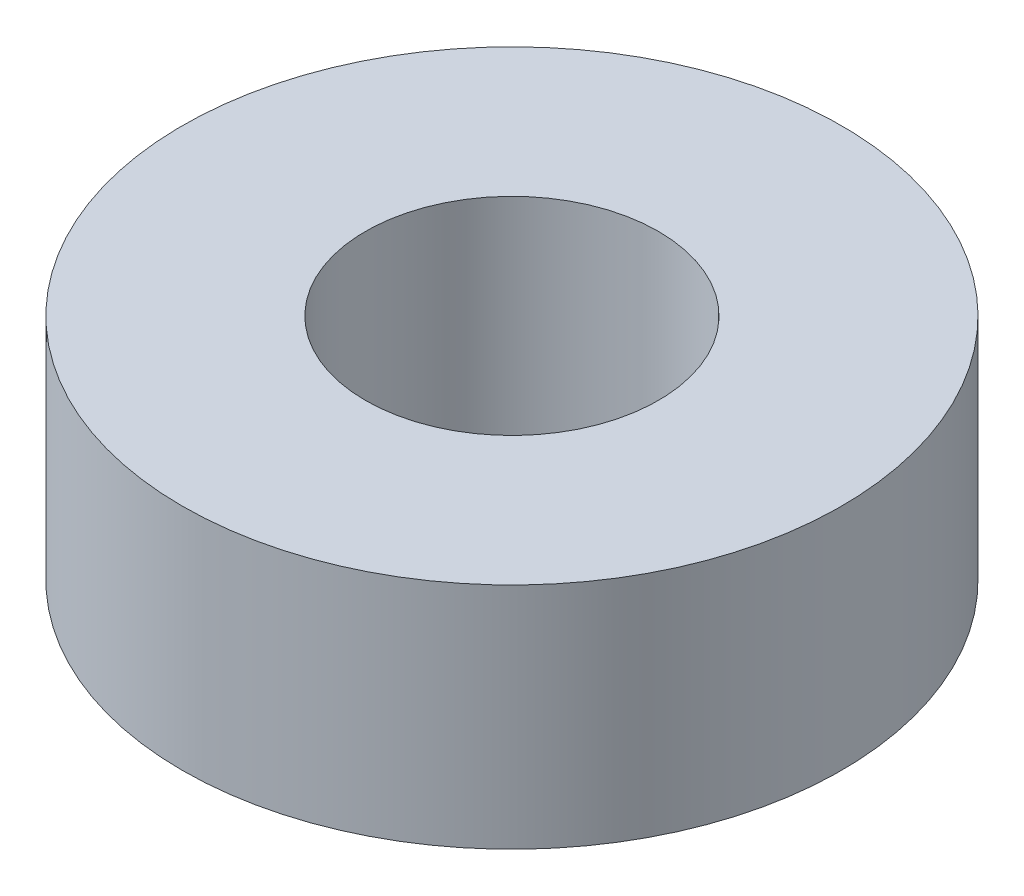
ISO-10303-21;
HEADER;
FILE_DESCRIPTION(('STEP AP214'),'2;1');
FILE_NAME('part.step','',(''),(''),'','','');
FILE_SCHEMA(('AUTOMOTIVE_DESIGN { 1 0 10303 214 1 1 1 1 }'));
ENDSEC;
DATA;
#1=APPLICATION_CONTEXT('core data for automotive mechanical design processes');
#2=APPLICATION_PROTOCOL_DEFINITION('international standard','automotive_design',2000,#1);
#3=PRODUCT_CONTEXT('',#1,'mechanical');
#4=PRODUCT('Part','Part','',(#3));
#5=PRODUCT_RELATED_PRODUCT_CATEGORY('part','',(#4));
#6=PRODUCT_DEFINITION_FORMATION('','',#4);
#7=PRODUCT_DEFINITION_CONTEXT('part definition',#1,'design');
#8=PRODUCT_DEFINITION('design','',#6,#7);
#9=PRODUCT_DEFINITION_SHAPE('','',#8);
#10=(LENGTH_UNIT() NAMED_UNIT(*) SI_UNIT(.MILLI.,.METRE.));
#11=(NAMED_UNIT(*) PLANE_ANGLE_UNIT() SI_UNIT($,.RADIAN.));
#12=(NAMED_UNIT(*) SI_UNIT($,.STERADIAN.) SOLID_ANGLE_UNIT());
#13=UNCERTAINTY_MEASURE_WITH_UNIT(LENGTH_MEASURE(1.E-05),#10,'distance_accuracy_value','');
#14=(GEOMETRIC_REPRESENTATION_CONTEXT(3) GLOBAL_UNCERTAINTY_ASSIGNED_CONTEXT((#13)) GLOBAL_UNIT_ASSIGNED_CONTEXT((#10,
#11,#12)) REPRESENTATION_CONTEXT('',''));
#15=CARTESIAN_POINT('',(0.,0.,0.));
#16=DIRECTION('',(0.,0.,1.));
#17=DIRECTION('',(1.,0.,0.));
#18=AXIS2_PLACEMENT_3D('',#15,#16,#17);
#19=CARTESIAN_POINT('',(0.,2.5,0.));
#20=DIRECTION('',(0.,1.,0.));
#21=DIRECTION('',(0.,0.,1.));
#22=AXIS2_PLACEMENT_3D('',#19,#20,#21);
#23=PLANE('',#22);
#24=CARTESIAN_POINT('',(0.,2.5,0.));
#25=DIRECTION('',(0.,1.,0.));
#26=DIRECTION('',(0.,0.,1.));
#27=AXIS2_PLACEMENT_3D('',#24,#25,#26);
#28=CIRCLE('',#27,3.6);
#29=CARTESIAN_POINT('',(0.,2.5,3.6));
#30=VERTEX_POINT('',#29);
#31=EDGE_CURVE('E10',#30,#30,#28,.T.);
#32=ORIENTED_EDGE('',*,*,#31,.T.);
#33=EDGE_LOOP('',(#32));
#34=FACE_BOUND('',#33,.T.);
#35=CARTESIAN_POINT('',(0.,2.5,0.));
#36=DIRECTION('',(0.,1.,0.));
#37=DIRECTION('',(0.,0.,1.));
#38=AXIS2_PLACEMENT_3D('',#35,#36,#37);
#39=CIRCLE('',#38,1.6);
#40=CARTESIAN_POINT('',(0.,2.5,1.6));
#41=VERTEX_POINT('',#40);
#42=EDGE_CURVE('E44',#41,#41,#39,.T.);
#43=ORIENTED_EDGE('',*,*,#42,.F.);
#44=EDGE_LOOP('',(#43));
#45=FACE_BOUND('',#44,.T.);
#46=ADVANCED_FACE('F33',(#34,#45),#23,.T.);
#47=CARTESIAN_POINT('',(0.,0.,0.));
#48=DIRECTION('',(0.,1.,0.));
#49=DIRECTION('',(0.,0.,1.));
#50=AXIS2_PLACEMENT_3D('',#47,#48,#49);
#51=PLANE('',#50);
#52=CARTESIAN_POINT('',(0.,0.,0.));
#53=DIRECTION('',(0.,1.,0.));
#54=DIRECTION('',(0.,0.,1.));
#55=AXIS2_PLACEMENT_3D('',#52,#53,#54);
#56=CIRCLE('',#55,3.6);
#57=CARTESIAN_POINT('',(0.,0.,3.6));
#58=VERTEX_POINT('',#57);
#59=EDGE_CURVE('E37',#58,#58,#56,.T.);
#60=ORIENTED_EDGE('',*,*,#59,.F.);
#61=EDGE_LOOP('',(#60));
#62=FACE_BOUND('',#61,.T.);
#63=CARTESIAN_POINT('',(0.,0.,0.));
#64=DIRECTION('',(0.,1.,0.));
#65=DIRECTION('',(0.,0.,1.));
#66=AXIS2_PLACEMENT_3D('',#63,#64,#65);
#67=CIRCLE('',#66,1.6);
#68=CARTESIAN_POINT('',(0.,0.,1.6));
#69=VERTEX_POINT('',#68);
#70=EDGE_CURVE('E46',#69,#69,#67,.T.);
#71=ORIENTED_EDGE('',*,*,#70,.T.);
#72=EDGE_LOOP('',(#71));
#73=FACE_BOUND('',#72,.T.);
#74=ADVANCED_FACE('F56',(#62,#73),#51,.F.);
#75=CARTESIAN_POINT('',(0.,2.5,0.));
#76=DIRECTION('',(0.,-1.,0.));
#77=DIRECTION('',(0.,0.,-1.));
#78=AXIS2_PLACEMENT_3D('',#75,#76,#77);
#79=CYLINDRICAL_SURFACE('',#78,3.6);
#80=ORIENTED_EDGE('',*,*,#31,.F.);
#81=EDGE_LOOP('',(#80));
#82=FACE_BOUND('',#81,.T.);
#83=ORIENTED_EDGE('',*,*,#59,.T.);
#84=EDGE_LOOP('',(#83));
#85=FACE_BOUND('',#84,.T.);
#86=ADVANCED_FACE('F35',(#82,#85),#79,.T.);
#87=CARTESIAN_POINT('',(0.,2.5,0.));
#88=DIRECTION('',(0.,-1.,0.));
#89=DIRECTION('',(0.,0.,-1.));
#90=AXIS2_PLACEMENT_3D('',#87,#88,#89);
#91=CYLINDRICAL_SURFACE('',#90,1.6);
#92=ORIENTED_EDGE('',*,*,#42,.T.);
#93=EDGE_LOOP('',(#92));
#94=FACE_BOUND('',#93,.T.);
#95=ORIENTED_EDGE('',*,*,#70,.F.);
#96=EDGE_LOOP('',(#95));
#97=FACE_BOUND('',#96,.T.);
#98=ADVANCED_FACE('F52',(#94,#97),#91,.F.);
#99=CLOSED_SHELL('',(#46,#74,#86,#98));
#100=MANIFOLD_SOLID_BREP('B2',#99);
#101=ADVANCED_BREP_SHAPE_REPRESENTATION('',(#18,#100),#14);
#102=SHAPE_DEFINITION_REPRESENTATION(#9,#101);
ENDSEC;
END-ISO-10303-21;
